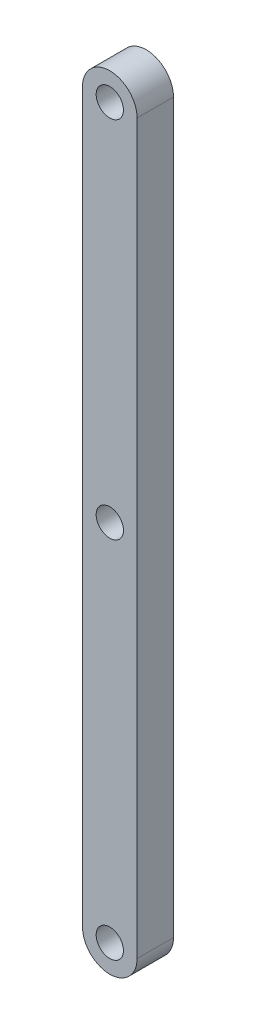
ISO-10303-21;
HEADER;
FILE_DESCRIPTION(('STEP AP214'),'2;1');
FILE_NAME('part.step','',(''),(''),'','','');
FILE_SCHEMA(('AUTOMOTIVE_DESIGN { 1 0 10303 214 1 1 1 1 }'));
ENDSEC;
DATA;
#1=APPLICATION_CONTEXT('core data for automotive mechanical design processes');
#2=APPLICATION_PROTOCOL_DEFINITION('international standard','automotive_design',2000,#1);
#3=PRODUCT_CONTEXT('',#1,'mechanical');
#4=PRODUCT('Part','Part','',(#3));
#5=PRODUCT_RELATED_PRODUCT_CATEGORY('part','',(#4));
#6=PRODUCT_DEFINITION_FORMATION('','',#4);
#7=PRODUCT_DEFINITION_CONTEXT('part definition',#1,'design');
#8=PRODUCT_DEFINITION('design','',#6,#7);
#9=PRODUCT_DEFINITION_SHAPE('','',#8);
#10=(LENGTH_UNIT() NAMED_UNIT(*) SI_UNIT(.MILLI.,.METRE.));
#11=(NAMED_UNIT(*) PLANE_ANGLE_UNIT() SI_UNIT($,.RADIAN.));
#12=(NAMED_UNIT(*) SI_UNIT($,.STERADIAN.) SOLID_ANGLE_UNIT());
#13=UNCERTAINTY_MEASURE_WITH_UNIT(LENGTH_MEASURE(1.E-05),#10,'distance_accuracy_value','');
#14=(GEOMETRIC_REPRESENTATION_CONTEXT(3) GLOBAL_UNCERTAINTY_ASSIGNED_CONTEXT((#13)) GLOBAL_UNIT_ASSIGNED_CONTEXT((#10,
#11,#12)) REPRESENTATION_CONTEXT('',''));
#15=CARTESIAN_POINT('',(0.,0.,0.));
#16=DIRECTION('',(0.,0.,1.));
#17=DIRECTION('',(1.,0.,0.));
#18=AXIS2_PLACEMENT_3D('',#15,#16,#17);
#19=CARTESIAN_POINT('',(0.,0.,20.));
#20=DIRECTION('',(0.,0.,1.));
#21=DIRECTION('',(1.,0.,0.));
#22=AXIS2_PLACEMENT_3D('',#19,#20,#21);
#23=PLANE('',#22);
#24=CARTESIAN_POINT('',(0.,200.,20.));
#25=DIRECTION('',(0.,0.,1.));
#26=DIRECTION('',(1.,0.,0.));
#27=AXIS2_PLACEMENT_3D('',#24,#25,#26);
#28=CIRCLE('',#27,7.50000000000001);
#29=CARTESIAN_POINT('',(7.50000000000001,200.,20.));
#30=VERTEX_POINT('',#29);
#31=EDGE_CURVE('E142',#30,#30,#28,.T.);
#32=ORIENTED_EDGE('',*,*,#31,.F.);
#33=EDGE_LOOP('',(#32));
#34=FACE_BOUND('',#33,.T.);
#35=CARTESIAN_POINT('',(0.,0.,20.));
#36=DIRECTION('',(0.,0.,1.));
#37=DIRECTION('',(1.,0.,0.));
#38=AXIS2_PLACEMENT_3D('',#35,#36,#37);
#39=CIRCLE('',#38,15.);
#40=CARTESIAN_POINT('',(-15.,0.,20.));
#41=VERTEX_POINT('',#40);
#42=CARTESIAN_POINT('',(15.,0.,20.));
#43=VERTEX_POINT('',#42);
#44=EDGE_CURVE('E100',#41,#43,#39,.T.);
#45=ORIENTED_EDGE('',*,*,#44,.T.);
#46=DIRECTION('',(0.,1.,0.));
#47=VECTOR('',#46,1.);
#48=CARTESIAN_POINT('',(15.,0.,20.));
#49=LINE('',#48,#47);
#50=CARTESIAN_POINT('',(15.,400.,20.));
#51=VERTEX_POINT('',#50);
#52=EDGE_CURVE('E95',#43,#51,#49,.T.);
#53=ORIENTED_EDGE('',*,*,#52,.T.);
#54=CARTESIAN_POINT('',(0.,400.,20.));
#55=DIRECTION('',(0.,0.,1.));
#56=DIRECTION('',(1.,0.,0.));
#57=AXIS2_PLACEMENT_3D('',#54,#55,#56);
#58=CIRCLE('',#57,15.);
#59=CARTESIAN_POINT('',(-15.,400.,20.));
#60=VERTEX_POINT('',#59);
#61=EDGE_CURVE('E98',#51,#60,#58,.T.);
#62=ORIENTED_EDGE('',*,*,#61,.T.);
#63=DIRECTION('',(0.,-1.,0.));
#64=VECTOR('',#63,1.);
#65=CARTESIAN_POINT('',(-15.,0.,20.));
#66=LINE('',#65,#64);
#67=EDGE_CURVE('E65',#60,#41,#66,.T.);
#68=ORIENTED_EDGE('',*,*,#67,.T.);
#69=EDGE_LOOP('',(#45,#53,#62,#68));
#70=FACE_BOUND('',#69,.T.);
#71=CARTESIAN_POINT('',(0.,400.,20.));
#72=DIRECTION('',(0.,0.,1.));
#73=DIRECTION('',(1.,0.,0.));
#74=AXIS2_PLACEMENT_3D('',#71,#72,#73);
#75=CIRCLE('',#74,7.50000000000001);
#76=CARTESIAN_POINT('',(7.50000000000001,400.,20.));
#77=VERTEX_POINT('',#76);
#78=EDGE_CURVE('E120',#77,#77,#75,.T.);
#79=ORIENTED_EDGE('',*,*,#78,.F.);
#80=EDGE_LOOP('',(#79));
#81=FACE_BOUND('',#80,.T.);
#82=CARTESIAN_POINT('',(0.,0.,20.));
#83=DIRECTION('',(0.,0.,1.));
#84=DIRECTION('',(1.,0.,0.));
#85=AXIS2_PLACEMENT_3D('',#82,#83,#84);
#86=CIRCLE('',#85,7.5);
#87=CARTESIAN_POINT('',(7.5,0.,20.));
#88=VERTEX_POINT('',#87);
#89=EDGE_CURVE('E150',#88,#88,#86,.T.);
#90=ORIENTED_EDGE('',*,*,#89,.F.);
#91=EDGE_LOOP('',(#90));
#92=FACE_BOUND('',#91,.T.);
#93=ADVANCED_FACE('F47',(#34,#70,#81,#92),#23,.T.);
#94=CARTESIAN_POINT('',(0.,0.,0.));
#95=DIRECTION('',(0.,0.,1.));
#96=DIRECTION('',(1.,0.,0.));
#97=AXIS2_PLACEMENT_3D('',#94,#95,#96);
#98=PLANE('',#97);
#99=CARTESIAN_POINT('',(0.,0.,0.));
#100=DIRECTION('',(0.,0.,1.));
#101=DIRECTION('',(1.,0.,0.));
#102=AXIS2_PLACEMENT_3D('',#99,#100,#101);
#103=CIRCLE('',#102,15.);
#104=CARTESIAN_POINT('',(-15.,0.,0.));
#105=VERTEX_POINT('',#104);
#106=CARTESIAN_POINT('',(15.,0.,0.));
#107=VERTEX_POINT('',#106);
#108=EDGE_CURVE('E116',#105,#107,#103,.T.);
#109=ORIENTED_EDGE('',*,*,#108,.F.);
#110=DIRECTION('',(0.,-1.,0.));
#111=VECTOR('',#110,1.);
#112=CARTESIAN_POINT('',(-15.,0.,0.));
#113=LINE('',#112,#111);
#114=CARTESIAN_POINT('',(-15.,400.,0.));
#115=VERTEX_POINT('',#114);
#116=EDGE_CURVE('E88',#115,#105,#113,.T.);
#117=ORIENTED_EDGE('',*,*,#116,.F.);
#118=CARTESIAN_POINT('',(0.,400.,0.));
#119=DIRECTION('',(0.,0.,1.));
#120=DIRECTION('',(1.,0.,0.));
#121=AXIS2_PLACEMENT_3D('',#118,#119,#120);
#122=CIRCLE('',#121,15.);
#123=CARTESIAN_POINT('',(15.,400.,0.));
#124=VERTEX_POINT('',#123);
#125=EDGE_CURVE('E82',#124,#115,#122,.T.);
#126=ORIENTED_EDGE('',*,*,#125,.F.);
#127=DIRECTION('',(0.,1.,0.));
#128=VECTOR('',#127,1.);
#129=CARTESIAN_POINT('',(15.,0.,0.));
#130=LINE('',#129,#128);
#131=EDGE_CURVE('E105',#107,#124,#130,.T.);
#132=ORIENTED_EDGE('',*,*,#131,.F.);
#133=EDGE_LOOP('',(#109,#117,#126,#132));
#134=FACE_BOUND('',#133,.T.);
#135=CARTESIAN_POINT('',(0.,400.,0.));
#136=DIRECTION('',(0.,0.,1.));
#137=DIRECTION('',(1.,0.,0.));
#138=AXIS2_PLACEMENT_3D('',#135,#136,#137);
#139=CIRCLE('',#138,7.50000000000001);
#140=CARTESIAN_POINT('',(7.50000000000001,400.,0.));
#141=VERTEX_POINT('',#140);
#142=EDGE_CURVE('E138',#141,#141,#139,.T.);
#143=ORIENTED_EDGE('',*,*,#142,.T.);
#144=EDGE_LOOP('',(#143));
#145=FACE_BOUND('',#144,.T.);
#146=CARTESIAN_POINT('',(0.,200.,0.));
#147=DIRECTION('',(0.,0.,1.));
#148=DIRECTION('',(1.,0.,0.));
#149=AXIS2_PLACEMENT_3D('',#146,#147,#148);
#150=CIRCLE('',#149,7.50000000000001);
#151=CARTESIAN_POINT('',(7.50000000000001,200.,0.));
#152=VERTEX_POINT('',#151);
#153=EDGE_CURVE('E146',#152,#152,#150,.T.);
#154=ORIENTED_EDGE('',*,*,#153,.T.);
#155=EDGE_LOOP('',(#154));
#156=FACE_BOUND('',#155,.T.);
#157=CARTESIAN_POINT('',(0.,0.,0.));
#158=DIRECTION('',(0.,0.,1.));
#159=DIRECTION('',(1.,0.,0.));
#160=AXIS2_PLACEMENT_3D('',#157,#158,#159);
#161=CIRCLE('',#160,7.5);
#162=CARTESIAN_POINT('',(7.5,0.,0.));
#163=VERTEX_POINT('',#162);
#164=EDGE_CURVE('E154',#163,#163,#161,.T.);
#165=ORIENTED_EDGE('',*,*,#164,.T.);
#166=EDGE_LOOP('',(#165));
#167=FACE_BOUND('',#166,.T.);
#168=ADVANCED_FACE('F133',(#134,#145,#156,#167),#98,.F.);
#169=CARTESIAN_POINT('',(0.,0.,20.));
#170=DIRECTION('',(0.,0.,-1.));
#171=DIRECTION('',(-1.,0.,0.));
#172=AXIS2_PLACEMENT_3D('',#169,#170,#171);
#173=CYLINDRICAL_SURFACE('',#172,15.);
#174=ORIENTED_EDGE('',*,*,#108,.T.);
#175=DIRECTION('',(0.,0.,-1.));
#176=VECTOR('',#175,1.);
#177=CARTESIAN_POINT('',(15.,0.,20.));
#178=LINE('',#177,#176);
#179=EDGE_CURVE('E11',#43,#107,#178,.T.);
#180=ORIENTED_EDGE('',*,*,#179,.F.);
#181=ORIENTED_EDGE('',*,*,#44,.F.);
#182=DIRECTION('',(0.,0.,-1.));
#183=VECTOR('',#182,1.);
#184=CARTESIAN_POINT('',(-15.,0.,20.));
#185=LINE('',#184,#183);
#186=EDGE_CURVE('E112',#41,#105,#185,.T.);
#187=ORIENTED_EDGE('',*,*,#186,.T.);
#188=EDGE_LOOP('',(#174,#180,#181,#187));
#189=FACE_BOUND('',#188,.T.);
#190=ADVANCED_FACE('F49',(#189),#173,.T.);
#191=CARTESIAN_POINT('',(15.,0.,20.));
#192=DIRECTION('',(-1.,0.,0.));
#193=DIRECTION('',(0.,0.,1.));
#194=AXIS2_PLACEMENT_3D('',#191,#192,#193);
#195=PLANE('',#194);
#196=ORIENTED_EDGE('',*,*,#131,.T.);
#197=DIRECTION('',(0.,0.,-1.));
#198=VECTOR('',#197,1.);
#199=CARTESIAN_POINT('',(15.,400.,20.));
#200=LINE('',#199,#198);
#201=EDGE_CURVE('E57',#51,#124,#200,.T.);
#202=ORIENTED_EDGE('',*,*,#201,.F.);
#203=ORIENTED_EDGE('',*,*,#52,.F.);
#204=ORIENTED_EDGE('',*,*,#179,.T.);
#205=EDGE_LOOP('',(#196,#202,#203,#204));
#206=FACE_BOUND('',#205,.T.);
#207=ADVANCED_FACE('F104',(#206),#195,.F.);
#208=CARTESIAN_POINT('',(0.,400.,20.));
#209=DIRECTION('',(0.,0.,-1.));
#210=DIRECTION('',(-1.,0.,0.));
#211=AXIS2_PLACEMENT_3D('',#208,#209,#210);
#212=CYLINDRICAL_SURFACE('',#211,15.);
#213=ORIENTED_EDGE('',*,*,#125,.T.);
#214=DIRECTION('',(0.,0.,-1.));
#215=VECTOR('',#214,1.);
#216=CARTESIAN_POINT('',(-15.,400.,20.));
#217=LINE('',#216,#215);
#218=EDGE_CURVE('E107',#60,#115,#217,.T.);
#219=ORIENTED_EDGE('',*,*,#218,.F.);
#220=ORIENTED_EDGE('',*,*,#61,.F.);
#221=ORIENTED_EDGE('',*,*,#201,.T.);
#222=EDGE_LOOP('',(#213,#219,#220,#221));
#223=FACE_BOUND('',#222,.T.);
#224=ADVANCED_FACE('F108',(#223),#212,.T.);
#225=CARTESIAN_POINT('',(-15.,0.,20.));
#226=DIRECTION('',(1.,0.,0.));
#227=DIRECTION('',(0.,0.,-1.));
#228=AXIS2_PLACEMENT_3D('',#225,#226,#227);
#229=PLANE('',#228);
#230=ORIENTED_EDGE('',*,*,#116,.T.);
#231=ORIENTED_EDGE('',*,*,#186,.F.);
#232=ORIENTED_EDGE('',*,*,#67,.F.);
#233=ORIENTED_EDGE('',*,*,#218,.T.);
#234=EDGE_LOOP('',(#230,#231,#232,#233));
#235=FACE_BOUND('',#234,.T.);
#236=ADVANCED_FACE('F130',(#235),#229,.F.);
#237=CARTESIAN_POINT('',(0.,400.,20.));
#238=DIRECTION('',(0.,0.,-1.));
#239=DIRECTION('',(-1.,0.,0.));
#240=AXIS2_PLACEMENT_3D('',#237,#238,#239);
#241=CYLINDRICAL_SURFACE('',#240,7.50000000000001);
#242=ORIENTED_EDGE('',*,*,#78,.T.);
#243=EDGE_LOOP('',(#242));
#244=FACE_BOUND('',#243,.T.);
#245=ORIENTED_EDGE('',*,*,#142,.F.);
#246=EDGE_LOOP('',(#245));
#247=FACE_BOUND('',#246,.T.);
#248=ADVANCED_FACE('F174',(#244,#247),#241,.F.);
#249=CARTESIAN_POINT('',(0.,200.,20.));
#250=DIRECTION('',(0.,0.,-1.));
#251=DIRECTION('',(-1.,0.,0.));
#252=AXIS2_PLACEMENT_3D('',#249,#250,#251);
#253=CYLINDRICAL_SURFACE('',#252,7.50000000000001);
#254=ORIENTED_EDGE('',*,*,#31,.T.);
#255=EDGE_LOOP('',(#254));
#256=FACE_BOUND('',#255,.T.);
#257=ORIENTED_EDGE('',*,*,#153,.F.);
#258=EDGE_LOOP('',(#257));
#259=FACE_BOUND('',#258,.T.);
#260=ADVANCED_FACE('F219',(#256,#259),#253,.F.);
#261=CARTESIAN_POINT('',(0.,0.,20.));
#262=DIRECTION('',(0.,0.,-1.));
#263=DIRECTION('',(-1.,0.,0.));
#264=AXIS2_PLACEMENT_3D('',#261,#262,#263);
#265=CYLINDRICAL_SURFACE('',#264,7.5);
#266=ORIENTED_EDGE('',*,*,#89,.T.);
#267=EDGE_LOOP('',(#266));
#268=FACE_BOUND('',#267,.T.);
#269=ORIENTED_EDGE('',*,*,#164,.F.);
#270=EDGE_LOOP('',(#269));
#271=FACE_BOUND('',#270,.T.);
#272=ADVANCED_FACE('F162',(#268,#271),#265,.F.);
#273=CLOSED_SHELL('',(#93,#168,#190,#207,#224,#236,#248,#260,#272));
#274=MANIFOLD_SOLID_BREP('B2',#273);
#275=ADVANCED_BREP_SHAPE_REPRESENTATION('',(#18,#274),#14);
#276=SHAPE_DEFINITION_REPRESENTATION(#9,#275);
ENDSEC;
END-ISO-10303-21;
